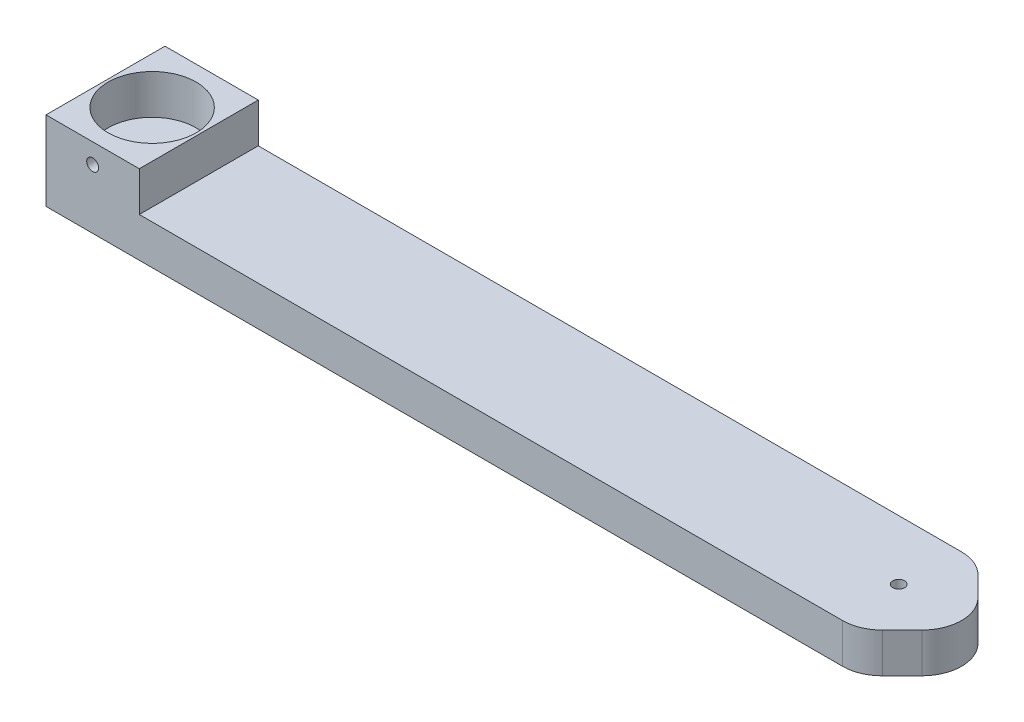
ISO-10303-21;
HEADER;
FILE_DESCRIPTION(('STEP AP214'),'2;1');
FILE_NAME('part.step','',(''),(''),'','','');
FILE_SCHEMA(('AUTOMOTIVE_DESIGN { 1 0 10303 214 1 1 1 1 }'));
ENDSEC;
DATA;
#1=APPLICATION_CONTEXT('core data for automotive mechanical design processes');
#2=APPLICATION_PROTOCOL_DEFINITION('international standard','automotive_design',2000,#1);
#3=PRODUCT_CONTEXT('',#1,'mechanical');
#4=PRODUCT('Part','Part','',(#3));
#5=PRODUCT_RELATED_PRODUCT_CATEGORY('part','',(#4));
#6=PRODUCT_DEFINITION_FORMATION('','',#4);
#7=PRODUCT_DEFINITION_CONTEXT('part definition',#1,'design');
#8=PRODUCT_DEFINITION('design','',#6,#7);
#9=PRODUCT_DEFINITION_SHAPE('','',#8);
#10=(LENGTH_UNIT() NAMED_UNIT(*) SI_UNIT(.MILLI.,.METRE.));
#11=(NAMED_UNIT(*) PLANE_ANGLE_UNIT() SI_UNIT($,.RADIAN.));
#12=(NAMED_UNIT(*) SI_UNIT($,.STERADIAN.) SOLID_ANGLE_UNIT());
#13=UNCERTAINTY_MEASURE_WITH_UNIT(LENGTH_MEASURE(1.E-05),#10,'distance_accuracy_value','');
#14=(GEOMETRIC_REPRESENTATION_CONTEXT(3) GLOBAL_UNCERTAINTY_ASSIGNED_CONTEXT((#13)) GLOBAL_UNIT_ASSIGNED_CONTEXT((#10,
#11,#12)) REPRESENTATION_CONTEXT('',''));
#15=CARTESIAN_POINT('',(0.,0.,0.));
#16=DIRECTION('',(0.,0.,1.));
#17=DIRECTION('',(1.,0.,0.));
#18=AXIS2_PLACEMENT_3D('',#15,#16,#17);
#19=CARTESIAN_POINT('',(0.,10.,0.));
#20=DIRECTION('',(0.,-1.,0.));
#21=DIRECTION('',(0.,0.,-1.));
#22=AXIS2_PLACEMENT_3D('',#19,#20,#21);
#23=PLANE('',#22);
#24=CARTESIAN_POINT('',(90.,10.,0.));
#25=DIRECTION('',(0.,-1.,0.));
#26=DIRECTION('',(0.,0.,-1.));
#27=AXIS2_PLACEMENT_3D('',#24,#25,#26);
#28=CIRCLE('',#27,1.5);
#29=CARTESIAN_POINT('',(90.,10.,-1.5));
#30=VERTEX_POINT('',#29);
#31=EDGE_CURVE('E194',#30,#30,#28,.T.);
#32=ORIENTED_EDGE('',*,*,#31,.T.);
#33=EDGE_LOOP('',(#32));
#34=FACE_BOUND('',#33,.T.);
#35=DIRECTION('',(0.707106781186548,0.,0.707106781186547));
#36=VECTOR('',#35,1.);
#37=CARTESIAN_POINT('',(55.,10.,-55.));
#38=LINE('',#37,#36);
#39=CARTESIAN_POINT('',(97.9289321881346,10.,-12.0710678118655));
#40=VERTEX_POINT('',#39);
#41=CARTESIAN_POINT('',(102.928932188135,10.,-7.07106781186548));
#42=VERTEX_POINT('',#41);
#43=EDGE_CURVE('E271',#40,#42,#38,.T.);
#44=ORIENTED_EDGE('',*,*,#43,.F.);
#45=CARTESIAN_POINT('',(90.8578643762691,10.,-5.));
#46=DIRECTION('',(0.,-1.,0.));
#47=DIRECTION('',(0.,0.,-1.));
#48=AXIS2_PLACEMENT_3D('',#45,#46,#47);
#49=CIRCLE('',#48,10.);
#50=CARTESIAN_POINT('',(90.8578643762691,10.,-15.));
#51=VERTEX_POINT('',#50);
#52=EDGE_CURVE('E315',#40,#51,#49,.F.);
#53=ORIENTED_EDGE('',*,*,#52,.T.);
#54=DIRECTION('',(-1.,0.,0.));
#55=VECTOR('',#54,1.);
#56=CARTESIAN_POINT('',(-110.,10.,-15.));
#57=LINE('',#56,#55);
#58=CARTESIAN_POINT('',(-86.4763084279896,10.,-15.));
#59=VERTEX_POINT('',#58);
#60=EDGE_CURVE('E165',#51,#59,#57,.T.);
#61=ORIENTED_EDGE('',*,*,#60,.T.);
#62=DIRECTION('',(0.,0.,-1.));
#63=VECTOR('',#62,1.);
#64=CARTESIAN_POINT('',(-86.4763084279896,10.,0.));
#65=LINE('',#64,#63);
#66=CARTESIAN_POINT('',(-86.4763084279896,10.,15.));
#67=VERTEX_POINT('',#66);
#68=EDGE_CURVE('E238',#67,#59,#65,.T.);
#69=ORIENTED_EDGE('',*,*,#68,.F.);
#70=DIRECTION('',(1.,0.,0.));
#71=VECTOR('',#70,1.);
#72=CARTESIAN_POINT('',(-110.,10.,15.));
#73=LINE('',#72,#71);
#74=CARTESIAN_POINT('',(90.8578643762691,10.,15.));
#75=VERTEX_POINT('',#74);
#76=EDGE_CURVE('E154',#67,#75,#73,.T.);
#77=ORIENTED_EDGE('',*,*,#76,.T.);
#78=CARTESIAN_POINT('',(90.8578643762691,10.,5.));
#79=DIRECTION('',(0.,-1.,0.));
#80=DIRECTION('',(0.,0.,-1.));
#81=AXIS2_PLACEMENT_3D('',#78,#79,#80);
#82=CIRCLE('',#81,10.);
#83=CARTESIAN_POINT('',(97.9289321881346,10.,12.0710678118655));
#84=VERTEX_POINT('',#83);
#85=EDGE_CURVE('E307',#75,#84,#82,.F.);
#86=ORIENTED_EDGE('',*,*,#85,.T.);
#87=DIRECTION('',(-0.707106781186548,0.,0.707106781186548));
#88=VECTOR('',#87,1.);
#89=CARTESIAN_POINT('',(55.,10.,55.));
#90=LINE('',#89,#88);
#91=CARTESIAN_POINT('',(102.928932188135,10.,7.07106781186546));
#92=VERTEX_POINT('',#91);
#93=EDGE_CURVE('E265',#92,#84,#90,.T.);
#94=ORIENTED_EDGE('',*,*,#93,.F.);
#95=CARTESIAN_POINT('',(95.8578643762691,10.,0.));
#96=DIRECTION('',(0.,-1.,0.));
#97=DIRECTION('',(0.,0.,-1.));
#98=AXIS2_PLACEMENT_3D('',#95,#96,#97);
#99=CIRCLE('',#98,10.);
#100=EDGE_CURVE('E306',#92,#42,#99,.F.);
#101=ORIENTED_EDGE('',*,*,#100,.T.);
#102=EDGE_LOOP('',(#44,#53,#61,#69,#77,#86,#94,#101));
#103=FACE_BOUND('',#102,.T.);
#104=ADVANCED_FACE('F45',(#34,#103),#23,.F.);
#105=CARTESIAN_POINT('',(-110.,10.,-15.));
#106=DIRECTION('',(0.,0.,1.));
#107=DIRECTION('',(1.,0.,0.));
#108=AXIS2_PLACEMENT_3D('',#105,#106,#107);
#109=PLANE('',#108);
#110=ORIENTED_EDGE('',*,*,#60,.F.);
#111=DIRECTION('',(0.,1.,0.));
#112=VECTOR('',#111,1.);
#113=CARTESIAN_POINT('',(90.8578643762691,10.,-15.));
#114=LINE('',#113,#112);
#115=CARTESIAN_POINT('',(90.8578643762691,0.,-15.));
#116=VERTEX_POINT('',#115);
#117=EDGE_CURVE('E297',#51,#116,#114,.F.);
#118=ORIENTED_EDGE('',*,*,#117,.T.);
#119=DIRECTION('',(-1.,0.,0.));
#120=VECTOR('',#119,1.);
#121=CARTESIAN_POINT('',(-110.,0.,-15.));
#122=LINE('',#121,#120);
#123=CARTESIAN_POINT('',(-110.,0.,-15.));
#124=VERTEX_POINT('',#123);
#125=EDGE_CURVE('E156',#116,#124,#122,.T.);
#126=ORIENTED_EDGE('',*,*,#125,.T.);
#127=DIRECTION('',(0.,-1.,0.));
#128=VECTOR('',#127,1.);
#129=CARTESIAN_POINT('',(-110.,10.,-15.));
#130=LINE('',#129,#128);
#131=CARTESIAN_POINT('',(-110.,20.,-15.));
#132=VERTEX_POINT('',#131);
#133=EDGE_CURVE('E178',#132,#124,#130,.T.);
#134=ORIENTED_EDGE('',*,*,#133,.F.);
#135=DIRECTION('',(-1.,0.,0.));
#136=VECTOR('',#135,1.);
#137=CARTESIAN_POINT('',(0.,20.,-15.));
#138=LINE('',#137,#136);
#139=CARTESIAN_POINT('',(-86.4763084279896,20.,-15.));
#140=VERTEX_POINT('',#139);
#141=EDGE_CURVE('E138',#140,#132,#138,.T.);
#142=ORIENTED_EDGE('',*,*,#141,.F.);
#143=DIRECTION('',(0.,-1.,0.));
#144=VECTOR('',#143,1.);
#145=CARTESIAN_POINT('',(-86.4763084279896,20.,-15.));
#146=LINE('',#145,#144);
#147=EDGE_CURVE('E133',#140,#59,#146,.T.);
#148=ORIENTED_EDGE('',*,*,#147,.T.);
#149=EDGE_LOOP('',(#110,#118,#126,#134,#142,#148));
#150=FACE_BOUND('',#149,.T.);
#151=ADVANCED_FACE('F220',(#150),#109,.F.);
#152=CARTESIAN_POINT('',(-110.,10.,15.));
#153=DIRECTION('',(1.,0.,0.));
#154=DIRECTION('',(0.,0.,-1.));
#155=AXIS2_PLACEMENT_3D('',#152,#153,#154);
#156=PLANE('',#155);
#157=DIRECTION('',(0.,0.,1.));
#158=VECTOR('',#157,1.);
#159=CARTESIAN_POINT('',(-110.,0.,15.));
#160=LINE('',#159,#158);
#161=CARTESIAN_POINT('',(-110.,0.,15.));
#162=VERTEX_POINT('',#161);
#163=EDGE_CURVE('E160',#124,#162,#160,.T.);
#164=ORIENTED_EDGE('',*,*,#163,.T.);
#165=DIRECTION('',(0.,-1.,0.));
#166=VECTOR('',#165,1.);
#167=CARTESIAN_POINT('',(-110.,10.,15.));
#168=LINE('',#167,#166);
#169=CARTESIAN_POINT('',(-110.,20.,15.));
#170=VERTEX_POINT('',#169);
#171=EDGE_CURVE('E170',#170,#162,#168,.T.);
#172=ORIENTED_EDGE('',*,*,#171,.F.);
#173=DIRECTION('',(0.,0.,1.));
#174=VECTOR('',#173,1.);
#175=CARTESIAN_POINT('',(-110.,20.,0.));
#176=LINE('',#175,#174);
#177=EDGE_CURVE('E145',#132,#170,#176,.T.);
#178=ORIENTED_EDGE('',*,*,#177,.F.);
#179=ORIENTED_EDGE('',*,*,#133,.T.);
#180=EDGE_LOOP('',(#164,#172,#178,#179));
#181=FACE_BOUND('',#180,.T.);
#182=ADVANCED_FACE('F225',(#181),#156,.F.);
#183=CARTESIAN_POINT('',(-110.,10.,15.));
#184=DIRECTION('',(0.,0.,-1.));
#185=DIRECTION('',(-1.,0.,0.));
#186=AXIS2_PLACEMENT_3D('',#183,#184,#185);
#187=PLANE('',#186);
#188=CARTESIAN_POINT('',(-98.2381542139948,15.,15.));
#189=DIRECTION('',(0.,0.,1.));
#190=DIRECTION('',(1.,0.,0.));
#191=AXIS2_PLACEMENT_3D('',#188,#189,#190);
#192=CIRCLE('',#191,1.5);
#193=CARTESIAN_POINT('',(-96.7381542139948,15.,15.));
#194=VERTEX_POINT('',#193);
#195=EDGE_CURVE('E193',#194,#194,#192,.T.);
#196=ORIENTED_EDGE('',*,*,#195,.F.);
#197=EDGE_LOOP('',(#196));
#198=FACE_BOUND('',#197,.T.);
#199=DIRECTION('',(1.,0.,0.));
#200=VECTOR('',#199,1.);
#201=CARTESIAN_POINT('',(-110.,0.,15.));
#202=LINE('',#201,#200);
#203=CARTESIAN_POINT('',(90.8578643762691,0.,15.));
#204=VERTEX_POINT('',#203);
#205=EDGE_CURVE('E168',#162,#204,#202,.T.);
#206=ORIENTED_EDGE('',*,*,#205,.T.);
#207=DIRECTION('',(0.,1.,0.));
#208=VECTOR('',#207,1.);
#209=CARTESIAN_POINT('',(90.8578643762691,10.,15.));
#210=LINE('',#209,#208);
#211=EDGE_CURVE('E11',#204,#75,#210,.T.);
#212=ORIENTED_EDGE('',*,*,#211,.T.);
#213=ORIENTED_EDGE('',*,*,#76,.F.);
#214=DIRECTION('',(0.,-1.,0.));
#215=VECTOR('',#214,1.);
#216=CARTESIAN_POINT('',(-86.4763084279896,20.,15.));
#217=LINE('',#216,#215);
#218=CARTESIAN_POINT('',(-86.4763084279896,20.,15.));
#219=VERTEX_POINT('',#218);
#220=EDGE_CURVE('E131',#219,#67,#217,.T.);
#221=ORIENTED_EDGE('',*,*,#220,.F.);
#222=DIRECTION('',(1.,0.,0.));
#223=VECTOR('',#222,1.);
#224=CARTESIAN_POINT('',(0.,20.,15.));
#225=LINE('',#224,#223);
#226=EDGE_CURVE('E139',#170,#219,#225,.T.);
#227=ORIENTED_EDGE('',*,*,#226,.F.);
#228=ORIENTED_EDGE('',*,*,#171,.T.);
#229=EDGE_LOOP('',(#206,#212,#213,#221,#227,#228));
#230=FACE_BOUND('',#229,.T.);
#231=ADVANCED_FACE('F152',(#198,#230),#187,.F.);
#232=CARTESIAN_POINT('',(0.,0.,0.));
#233=DIRECTION('',(0.,-1.,0.));
#234=DIRECTION('',(0.,0.,-1.));
#235=AXIS2_PLACEMENT_3D('',#232,#233,#234);
#236=PLANE('',#235);
#237=ORIENTED_EDGE('',*,*,#125,.F.);
#238=CARTESIAN_POINT('',(90.8578643762691,0.,-5.));
#239=DIRECTION('',(0.,-1.,0.));
#240=DIRECTION('',(0.,0.,-1.));
#241=AXIS2_PLACEMENT_3D('',#238,#239,#240);
#242=CIRCLE('',#241,10.);
#243=CARTESIAN_POINT('',(97.9289321881346,0.,-12.0710678118655));
#244=VERTEX_POINT('',#243);
#245=EDGE_CURVE('E283',#116,#244,#242,.T.);
#246=ORIENTED_EDGE('',*,*,#245,.T.);
#247=DIRECTION('',(0.707106781186548,0.,0.707106781186547));
#248=VECTOR('',#247,1.);
#249=CARTESIAN_POINT('',(55.,0.,-55.));
#250=LINE('',#249,#248);
#251=CARTESIAN_POINT('',(102.928932188135,0.,-7.07106781186548));
#252=VERTEX_POINT('',#251);
#253=EDGE_CURVE('E268',#244,#252,#250,.T.);
#254=ORIENTED_EDGE('',*,*,#253,.T.);
#255=CARTESIAN_POINT('',(95.8578643762691,0.,0.));
#256=DIRECTION('',(0.,-1.,0.));
#257=DIRECTION('',(0.,0.,-1.));
#258=AXIS2_PLACEMENT_3D('',#255,#256,#257);
#259=CIRCLE('',#258,10.);
#260=CARTESIAN_POINT('',(102.928932188135,0.,7.07106781186546));
#261=VERTEX_POINT('',#260);
#262=EDGE_CURVE('E281',#252,#261,#259,.T.);
#263=ORIENTED_EDGE('',*,*,#262,.T.);
#264=DIRECTION('',(-0.707106781186548,0.,0.707106781186548));
#265=VECTOR('',#264,1.);
#266=CARTESIAN_POINT('',(55.,0.,55.));
#267=LINE('',#266,#265);
#268=CARTESIAN_POINT('',(97.9289321881346,0.,12.0710678118655));
#269=VERTEX_POINT('',#268);
#270=EDGE_CURVE('E264',#261,#269,#267,.T.);
#271=ORIENTED_EDGE('',*,*,#270,.T.);
#272=CARTESIAN_POINT('',(90.8578643762691,0.,5.));
#273=DIRECTION('',(0.,-1.,0.));
#274=DIRECTION('',(0.,0.,-1.));
#275=AXIS2_PLACEMENT_3D('',#272,#273,#274);
#276=CIRCLE('',#275,10.);
#277=EDGE_CURVE('E61',#269,#204,#276,.T.);
#278=ORIENTED_EDGE('',*,*,#277,.T.);
#279=ORIENTED_EDGE('',*,*,#205,.F.);
#280=ORIENTED_EDGE('',*,*,#163,.F.);
#281=EDGE_LOOP('',(#237,#246,#254,#263,#271,#278,#279,#280));
#282=FACE_BOUND('',#281,.T.);
#283=CARTESIAN_POINT('',(90.,0.,0.));
#284=DIRECTION('',(0.,-1.,0.));
#285=DIRECTION('',(0.,0.,-1.));
#286=AXIS2_PLACEMENT_3D('',#283,#284,#285);
#287=CIRCLE('',#286,4.00000000000001);
#288=CARTESIAN_POINT('',(90.,0.,-4.00000000000001));
#289=VERTEX_POINT('',#288);
#290=EDGE_CURVE('E253',#289,#289,#287,.T.);
#291=ORIENTED_EDGE('',*,*,#290,.F.);
#292=EDGE_LOOP('',(#291));
#293=FACE_BOUND('',#292,.T.);
#294=ADVANCED_FACE('F212',(#282,#293),#236,.T.);
#295=CARTESIAN_POINT('',(-86.4763084279896,20.,0.));
#296=DIRECTION('',(-1.,0.,0.));
#297=DIRECTION('',(0.,0.,1.));
#298=AXIS2_PLACEMENT_3D('',#295,#296,#297);
#299=PLANE('',#298);
#300=ORIENTED_EDGE('',*,*,#68,.T.);
#301=ORIENTED_EDGE('',*,*,#147,.F.);
#302=DIRECTION('',(0.,0.,-1.));
#303=VECTOR('',#302,1.);
#304=CARTESIAN_POINT('',(-86.4763084279896,20.,0.));
#305=LINE('',#304,#303);
#306=EDGE_CURVE('E126',#219,#140,#305,.T.);
#307=ORIENTED_EDGE('',*,*,#306,.F.);
#308=ORIENTED_EDGE('',*,*,#220,.T.);
#309=EDGE_LOOP('',(#300,#301,#307,#308));
#310=FACE_BOUND('',#309,.T.);
#311=ADVANCED_FACE('F129',(#310),#299,.F.);
#312=CARTESIAN_POINT('',(-98.2381542139948,20.,0.));
#313=DIRECTION('',(0.,-1.,0.));
#314=DIRECTION('',(0.,0.,-1.));
#315=AXIS2_PLACEMENT_3D('',#312,#313,#314);
#316=CYLINDRICAL_SURFACE('',#315,11.1);
#317=CARTESIAN_POINT('',(-96.7381542139948,15.,10.998181667894));
#318=CARTESIAN_POINT('',(-96.7381577421548,14.9161580954853,10.9981829557639));
#319=CARTESIAN_POINT('',(-96.7452074186348,14.8322652184173,10.9991507505894));
#320=CARTESIAN_POINT('',(-96.7732161645922,14.6668183546661,11.0029154546431));
#321=CARTESIAN_POINT('',(-96.79418939731,14.5852668378615,11.0057142263249));
#322=CARTESIAN_POINT('',(-96.8494120664486,14.4269218129182,11.0128182238988));
#323=CARTESIAN_POINT('',(-96.8836520407234,14.3501249588183,11.0171223759064));
#324=CARTESIAN_POINT('',(-96.9644151665419,14.203379937368,11.0267508792424));
#325=CARTESIAN_POINT('',(-97.0109363758672,14.1334306894973,11.0320750692203));
#326=CARTESIAN_POINT('',(-97.1152658675257,14.0018974483291,11.0431825945482));
#327=CARTESIAN_POINT('',(-97.1731383347784,13.9403645699134,11.0489684243663));
#328=CARTESIAN_POINT('',(-97.2983891762969,13.8278528521415,11.0603249492234));
#329=CARTESIAN_POINT('',(-97.3657680418306,13.7768745585574,11.0658956331254));
#330=CARTESIAN_POINT('',(-97.5084429135042,13.6867335573127,11.0762199772553));
#331=CARTESIAN_POINT('',(-97.5837686153888,13.6476174476807,11.0809703845469));
#332=CARTESIAN_POINT('',(-97.7399951518385,13.5826098531584,11.0890914287869));
#333=CARTESIAN_POINT('',(-97.8208957458081,13.556717797963,11.0924621252358));
#334=CARTESIAN_POINT('',(-97.9854511745742,13.5190469436924,11.0974263799507));
#335=CARTESIAN_POINT('',(-98.0690861624956,13.5071828855879,11.0990306698954));
#336=CARTESIAN_POINT('',(-98.2371742783783,13.4976403780351,11.1003180521346));
#337=CARTESIAN_POINT('',(-98.3216273688659,13.4999612818767,11.1000012320149));
#338=CARTESIAN_POINT('',(-98.4883736840594,13.5186548909547,11.0974907319258));
#339=CARTESIAN_POINT('',(-98.5706774001116,13.5349358910085,11.0953093010515));
#340=CARTESIAN_POINT('',(-98.7313736776881,13.5809439526343,11.0893283808514));
#341=CARTESIAN_POINT('',(-98.8097661544143,13.6106713055909,11.0855288564615));
#342=CARTESIAN_POINT('',(-98.9606961482123,13.6828243403859,11.0767175514228));
#343=CARTESIAN_POINT('',(-99.0332146647533,13.7252892923651,11.0717020311502));
#344=CARTESIAN_POINT('',(-99.1701309669941,13.8216834968355,11.0610190509994));
#345=CARTESIAN_POINT('',(-99.2345283175136,13.8756133632692,11.0553515562157));
#346=CARTESIAN_POINT('',(-99.3539137603019,13.9939191093961,11.0439446270947));
#347=CARTESIAN_POINT('',(-99.4088226048251,14.0583749700319,11.0382049796966));
#348=CARTESIAN_POINT('',(-99.5070553439775,14.1956294534787,11.0273451054238));
#349=CARTESIAN_POINT('',(-99.5503791903381,14.2684281110479,11.02222488113));
#350=CARTESIAN_POINT('',(-99.6242190128155,14.420376903148,11.0131837217841));
#351=CARTESIAN_POINT('',(-99.6547279529754,14.4995304984919,11.009263445877));
#352=CARTESIAN_POINT('',(-99.7019980419717,14.6619024856602,11.0030784252757));
#353=CARTESIAN_POINT('',(-99.718759969727,14.7451206468991,11.0008135867836));
#354=CARTESIAN_POINT('',(-99.7379538448058,14.9125576158437,10.9982132942663));
#355=CARTESIAN_POINT('',(-99.7404976293521,14.9967633780098,10.9978627830068));
#356=CARTESIAN_POINT('',(-99.7314787368078,15.1643999063732,10.9990909519926));
#357=CARTESIAN_POINT('',(-99.7199164126102,15.2478306919057,11.0006695839765));
#358=CARTESIAN_POINT('',(-99.6831079473996,15.4112094889582,11.0055643940137));
#359=CARTESIAN_POINT('',(-99.6579165593597,15.4911700624814,11.0088736178777));
#360=CARTESIAN_POINT('',(-99.5946216453565,15.6457328475667,11.0168510747456));
#361=CARTESIAN_POINT('',(-99.556517594015,15.7203348409544,11.0215193630447));
#362=CARTESIAN_POINT('',(-99.4682064289421,15.8625669940025,11.0317247959998));
#363=CARTESIAN_POINT('',(-99.4179263370772,15.9301514650908,11.0372671065441));
#364=CARTESIAN_POINT('',(-99.3067928599393,16.0559625834419,11.0485801494988));
#365=CARTESIAN_POINT('',(-99.2459389923142,16.114188803569,11.0543508923205));
#366=CARTESIAN_POINT('',(-99.1148952914844,16.2200268263599,11.0655171538427));
#367=CARTESIAN_POINT('',(-99.0446456380484,16.2675648973252,11.0709098994401));
#368=CARTESIAN_POINT('',(-98.897093332716,16.3501656702328,11.0806704804548));
#369=CARTESIAN_POINT('',(-98.8197908431557,16.3852286592247,11.0850383394537));
#370=CARTESIAN_POINT('',(-98.6605664935059,16.4417637106836,11.0922447647335));
#371=CARTESIAN_POINT('',(-98.5786596696302,16.4632774979969,11.0950880219759));
#372=CARTESIAN_POINT('',(-98.4123551001275,16.4922389343433,11.0989444503484));
#373=CARTESIAN_POINT('',(-98.3279574870187,16.4996873303363,11.0999577186621));
#374=CARTESIAN_POINT('',(-98.1597851266733,16.5002909534762,11.1000393464978));
#375=CARTESIAN_POINT('',(-98.0760107713658,16.4935595289681,11.099123129641));
#376=CARTESIAN_POINT('',(-97.9107960740157,16.4662357681133,11.0954795521128));
#377=CARTESIAN_POINT('',(-97.8293557283111,16.4456434535153,11.0927521942833));
#378=CARTESIAN_POINT('',(-97.6711420073339,16.3912198660331,11.0857913442088));
#379=CARTESIAN_POINT('',(-97.5943664066009,16.3573949643775,11.0815585768776));
#380=CARTESIAN_POINT('',(-97.4475628944882,16.2774781863336,11.072054142574));
#381=CARTESIAN_POINT('',(-97.3775351176018,16.2313860655117,11.066782454901));
#382=CARTESIAN_POINT('',(-97.2456374534114,16.1278273423753,11.0557374707626));
#383=CARTESIAN_POINT('',(-97.1838339130318,16.0702766067003,11.0499606527628));
#384=CARTESIAN_POINT('',(-97.0707186199083,15.9456104791326,11.0385839065207));
#385=CARTESIAN_POINT('',(-97.0194093449259,15.878492834766,11.0329840203164));
#386=CARTESIAN_POINT('',(-96.9285364103137,15.7362462648112,11.0225681672471));
#387=CARTESIAN_POINT('',(-96.8890268523811,15.6610825217623,11.0177558555934));
#388=CARTESIAN_POINT('',(-96.8232489966996,15.5051609892807,11.0095028013328));
#389=CARTESIAN_POINT('',(-96.7969665496887,15.4244092830578,11.0060605939305));
#390=CARTESIAN_POINT('',(-96.7645564482892,15.2860499711023,11.0017578570314));
#391=CARTESIAN_POINT('',(-96.7546701923185,15.2293085746893,11.0004236282957));
#392=CARTESIAN_POINT('',(-96.7414678956633,15.1150527828111,10.9986350959815));
#393=CARTESIAN_POINT('',(-96.7381517927156,15.0575383946764,10.9981807840643));
#394=CARTESIAN_POINT('',(-96.7381542139948,15.,10.998181667894));
#395=B_SPLINE_CURVE_WITH_KNOTS('',3,(#317,#318,#319,#320,#321,#322,#323,#324,#325,#326,#327,
#328,#329,#330,#331,#332,#333,#334,#335,#336,#337,#338,#339,#340,#341,#342,#343,#344,#345,#346,
#347,#348,#349,#350,#351,#352,#353,#354,#355,#356,#357,#358,#359,#360,#361,#362,#363,#364,#365,
#366,#367,#368,#369,#370,#371,#372,#373,#374,#375,#376,#377,#378,#379,#380,#381,#382,#383,#384,
#385,#386,#387,#388,#389,#390,#391,#392,#393,#394),.UNSPECIFIED.,.T.,.F.,(4,2,2,2,2,2,2,2,2,2,2,
2,2,2,2,2,2,2,2,2,2,2,2,2,2,2,2,2,2,2,2,2,2,2,2,2,2,2,4),(0.,0.251315475026076,
0.502886984255115,0.754279396186547,1.00563207540844,1.25844926325154,1.51127952087323,
1.76509047225189,2.01889047677066,2.27113988027382,2.52337778350097,2.77397129666125,
3.02457024048255,3.27594986605265,3.52734295631578,3.78074363304597,4.03414536554633,
4.2876860456496,4.54121235890301,4.79274164545197,5.04426463961617,5.29478459618081,
5.5453147468855,5.79738534556773,6.04946744616716,6.30323852618946,6.55700376660183,
6.80998366435175,7.0629501269153,7.31390214366,7.56485376664346,7.81568470980397,
8.0665206513315,8.31927116234466,8.57208128061707,8.82603333960262,9.07971316131319,
9.2521856988985,9.42465660201113),.UNSPECIFIED.);
#396=CARTESIAN_POINT('',(-96.7381542139948,15.,10.998181667894));
#397=VERTEX_POINT('',#396);
#398=EDGE_CURVE('E183',#397,#397,#395,.T.);
#399=ORIENTED_EDGE('',*,*,#398,.F.);
#400=EDGE_LOOP('',(#399));
#401=FACE_BOUND('',#400,.T.);
#402=CARTESIAN_POINT('',(-98.2381542139948,20.,0.));
#403=DIRECTION('',(0.,1.,0.));
#404=DIRECTION('',(0.,0.,1.));
#405=AXIS2_PLACEMENT_3D('',#402,#403,#404);
#406=CIRCLE('',#405,11.1);
#407=CARTESIAN_POINT('',(-98.2381542139948,20.,11.1));
#408=VERTEX_POINT('',#407);
#409=EDGE_CURVE('E149',#408,#408,#406,.T.);
#410=ORIENTED_EDGE('',*,*,#409,.T.);
#411=EDGE_LOOP('',(#410));
#412=FACE_BOUND('',#411,.T.);
#413=CARTESIAN_POINT('',(-98.2381542139948,10.,0.));
#414=DIRECTION('',(0.,1.,0.));
#415=DIRECTION('',(0.,0.,1.));
#416=AXIS2_PLACEMENT_3D('',#413,#414,#415);
#417=CIRCLE('',#416,11.1);
#418=CARTESIAN_POINT('',(-98.2381542139948,10.,11.1));
#419=VERTEX_POINT('',#418);
#420=EDGE_CURVE('E192',#419,#419,#417,.T.);
#421=ORIENTED_EDGE('',*,*,#420,.F.);
#422=EDGE_LOOP('',(#421));
#423=FACE_BOUND('',#422,.T.);
#424=ADVANCED_FACE('F196',(#401,#412,#423),#316,.F.);
#425=CARTESIAN_POINT('',(0.,20.,0.));
#426=DIRECTION('',(0.,1.,0.));
#427=DIRECTION('',(0.,0.,1.));
#428=AXIS2_PLACEMENT_3D('',#425,#426,#427);
#429=PLANE('',#428);
#430=ORIENTED_EDGE('',*,*,#409,.F.);
#431=EDGE_LOOP('',(#430));
#432=FACE_BOUND('',#431,.T.);
#433=ORIENTED_EDGE('',*,*,#226,.T.);
#434=ORIENTED_EDGE('',*,*,#306,.T.);
#435=ORIENTED_EDGE('',*,*,#141,.T.);
#436=ORIENTED_EDGE('',*,*,#177,.T.);
#437=EDGE_LOOP('',(#433,#434,#435,#436));
#438=FACE_BOUND('',#437,.T.);
#439=ADVANCED_FACE('F143',(#432,#438),#429,.T.);
#440=ORIENTED_EDGE('',*,*,#420,.T.);
#441=EDGE_LOOP('',(#440));
#442=FACE_BOUND('',#441,.T.);
#443=ADVANCED_FACE('F206',(#442),#23,.F.);
#444=CARTESIAN_POINT('',(-98.2381542139948,15.,5.));
#445=DIRECTION('',(0.,0.,1.));
#446=DIRECTION('',(1.,0.,0.));
#447=AXIS2_PLACEMENT_3D('',#444,#445,#446);
#448=CYLINDRICAL_SURFACE('',#447,1.5);
#449=ORIENTED_EDGE('',*,*,#398,.T.);
#450=EDGE_LOOP('',(#449));
#451=FACE_BOUND('',#450,.T.);
#452=ORIENTED_EDGE('',*,*,#195,.T.);
#453=EDGE_LOOP('',(#452));
#454=FACE_BOUND('',#453,.T.);
#455=ADVANCED_FACE('F200',(#451,#454),#448,.F.);
#456=CARTESIAN_POINT('',(90.,4.,0.));
#457=DIRECTION('',(0.,-1.,0.));
#458=DIRECTION('',(0.,0.,-1.));
#459=AXIS2_PLACEMENT_3D('',#456,#457,#458);
#460=CYLINDRICAL_SURFACE('',#459,4.00000000000001);
#461=CARTESIAN_POINT('',(90.,4.,0.));
#462=DIRECTION('',(0.,-1.,0.));
#463=DIRECTION('',(0.,0.,-1.));
#464=AXIS2_PLACEMENT_3D('',#461,#462,#463);
#465=CIRCLE('',#464,4.00000000000001);
#466=CARTESIAN_POINT('',(90.,4.,-4.00000000000001));
#467=VERTEX_POINT('',#466);
#468=EDGE_CURVE('E252',#467,#467,#465,.T.);
#469=ORIENTED_EDGE('',*,*,#468,.F.);
#470=EDGE_LOOP('',(#469));
#471=FACE_BOUND('',#470,.T.);
#472=ORIENTED_EDGE('',*,*,#290,.T.);
#473=EDGE_LOOP('',(#472));
#474=FACE_BOUND('',#473,.T.);
#475=ADVANCED_FACE('F205',(#471,#474),#460,.F.);
#476=CARTESIAN_POINT('',(90.,4.,0.));
#477=DIRECTION('',(0.,-1.,0.));
#478=DIRECTION('',(0.,0.,-1.));
#479=AXIS2_PLACEMENT_3D('',#476,#477,#478);
#480=PLANE('',#479);
#481=CARTESIAN_POINT('',(90.,4.,0.));
#482=DIRECTION('',(0.,-1.,0.));
#483=DIRECTION('',(0.,0.,-1.));
#484=AXIS2_PLACEMENT_3D('',#481,#482,#483);
#485=CIRCLE('',#484,1.5);
#486=CARTESIAN_POINT('',(90.,4.,-1.5));
#487=VERTEX_POINT('',#486);
#488=EDGE_CURVE('E260',#487,#487,#485,.T.);
#489=ORIENTED_EDGE('',*,*,#488,.F.);
#490=EDGE_LOOP('',(#489));
#491=FACE_BOUND('',#490,.T.);
#492=ORIENTED_EDGE('',*,*,#468,.T.);
#493=EDGE_LOOP('',(#492));
#494=FACE_BOUND('',#493,.T.);
#495=ADVANCED_FACE('F405',(#491,#494),#480,.T.);
#496=CARTESIAN_POINT('',(90.,18.,0.));
#497=DIRECTION('',(0.,-1.,0.));
#498=DIRECTION('',(0.,0.,-1.));
#499=AXIS2_PLACEMENT_3D('',#496,#497,#498);
#500=CYLINDRICAL_SURFACE('',#499,1.5);
#501=ORIENTED_EDGE('',*,*,#488,.T.);
#502=EDGE_LOOP('',(#501));
#503=FACE_BOUND('',#502,.T.);
#504=ORIENTED_EDGE('',*,*,#31,.F.);
#505=EDGE_LOOP('',(#504));
#506=FACE_BOUND('',#505,.T.);
#507=ADVANCED_FACE('F364',(#503,#506),#500,.F.);
#508=CARTESIAN_POINT('',(55.,0.,55.));
#509=DIRECTION('',(-0.707106781186548,0.,-0.707106781186548));
#510=DIRECTION('',(-0.707106781186548,0.,0.707106781186548));
#511=AXIS2_PLACEMENT_3D('',#508,#509,#510);
#512=PLANE('',#511);
#513=ORIENTED_EDGE('',*,*,#270,.F.);
#514=DIRECTION('',(0.,1.,0.));
#515=VECTOR('',#514,1.);
#516=CARTESIAN_POINT('',(102.928932188135,0.,7.07106781186547));
#517=LINE('',#516,#515);
#518=EDGE_CURVE('E54',#261,#92,#517,.T.);
#519=ORIENTED_EDGE('',*,*,#518,.T.);
#520=ORIENTED_EDGE('',*,*,#93,.T.);
#521=DIRECTION('',(0.,1.,0.));
#522=VECTOR('',#521,1.);
#523=CARTESIAN_POINT('',(97.9289321881346,0.,12.0710678118655));
#524=LINE('',#523,#522);
#525=EDGE_CURVE('E69',#84,#269,#524,.F.);
#526=ORIENTED_EDGE('',*,*,#525,.T.);
#527=EDGE_LOOP('',(#513,#519,#520,#526));
#528=FACE_BOUND('',#527,.T.);
#529=ADVANCED_FACE('F304',(#528),#512,.F.);
#530=CARTESIAN_POINT('',(55.,0.,-55.));
#531=DIRECTION('',(-0.707106781186547,0.,0.707106781186548));
#532=DIRECTION('',(0.707106781186548,0.,0.707106781186547));
#533=AXIS2_PLACEMENT_3D('',#530,#531,#532);
#534=PLANE('',#533);
#535=ORIENTED_EDGE('',*,*,#253,.F.);
#536=DIRECTION('',(0.,1.,0.));
#537=VECTOR('',#536,1.);
#538=CARTESIAN_POINT('',(97.9289321881346,0.,-12.0710678118655));
#539=LINE('',#538,#537);
#540=EDGE_CURVE('E311',#244,#40,#539,.T.);
#541=ORIENTED_EDGE('',*,*,#540,.T.);
#542=ORIENTED_EDGE('',*,*,#43,.T.);
#543=DIRECTION('',(0.,1.,0.));
#544=VECTOR('',#543,1.);
#545=CARTESIAN_POINT('',(102.928932188135,0.,-7.07106781186548));
#546=LINE('',#545,#544);
#547=EDGE_CURVE('E182',#42,#252,#546,.F.);
#548=ORIENTED_EDGE('',*,*,#547,.T.);
#549=EDGE_LOOP('',(#535,#541,#542,#548));
#550=FACE_BOUND('',#549,.T.);
#551=ADVANCED_FACE('F326',(#550),#534,.F.);
#552=CARTESIAN_POINT('',(90.8578643762691,0.,-5.));
#553=DIRECTION('',(0.,1.,0.));
#554=DIRECTION('',(0.,0.,1.));
#555=AXIS2_PLACEMENT_3D('',#552,#553,#554);
#556=CYLINDRICAL_SURFACE('',#555,10.);
#557=ORIENTED_EDGE('',*,*,#245,.F.);
#558=ORIENTED_EDGE('',*,*,#117,.F.);
#559=ORIENTED_EDGE('',*,*,#52,.F.);
#560=ORIENTED_EDGE('',*,*,#540,.F.);
#561=EDGE_LOOP('',(#557,#558,#559,#560));
#562=FACE_BOUND('',#561,.T.);
#563=ADVANCED_FACE('F325',(#562),#556,.T.);
#564=CARTESIAN_POINT('',(95.8578643762691,0.,0.));
#565=DIRECTION('',(0.,1.,0.));
#566=DIRECTION('',(0.,0.,1.));
#567=AXIS2_PLACEMENT_3D('',#564,#565,#566);
#568=CYLINDRICAL_SURFACE('',#567,10.);
#569=ORIENTED_EDGE('',*,*,#262,.F.);
#570=ORIENTED_EDGE('',*,*,#547,.F.);
#571=ORIENTED_EDGE('',*,*,#100,.F.);
#572=ORIENTED_EDGE('',*,*,#518,.F.);
#573=EDGE_LOOP('',(#569,#570,#571,#572));
#574=FACE_BOUND('',#573,.T.);
#575=ADVANCED_FACE('F290',(#574),#568,.T.);
#576=CARTESIAN_POINT('',(90.8578643762691,10.,5.));
#577=DIRECTION('',(0.,1.,0.));
#578=DIRECTION('',(0.,0.,1.));
#579=AXIS2_PLACEMENT_3D('',#576,#577,#578);
#580=CYLINDRICAL_SURFACE('',#579,10.);
#581=ORIENTED_EDGE('',*,*,#277,.F.);
#582=ORIENTED_EDGE('',*,*,#525,.F.);
#583=ORIENTED_EDGE('',*,*,#85,.F.);
#584=ORIENTED_EDGE('',*,*,#211,.F.);
#585=EDGE_LOOP('',(#581,#582,#583,#584));
#586=FACE_BOUND('',#585,.T.);
#587=ADVANCED_FACE('F47',(#586),#580,.T.);
#588=CLOSED_SHELL('',(#104,#151,#182,#231,#294,#311,#424,#439,#443,#455,#475,#495,#507,#529,
#551,#563,#575,#587));
#589=MANIFOLD_SOLID_BREP('B2',#588);
#590=ADVANCED_BREP_SHAPE_REPRESENTATION('',(#18,#589),#14);
#591=SHAPE_DEFINITION_REPRESENTATION(#9,#590);
ENDSEC;
END-ISO-10303-21;
